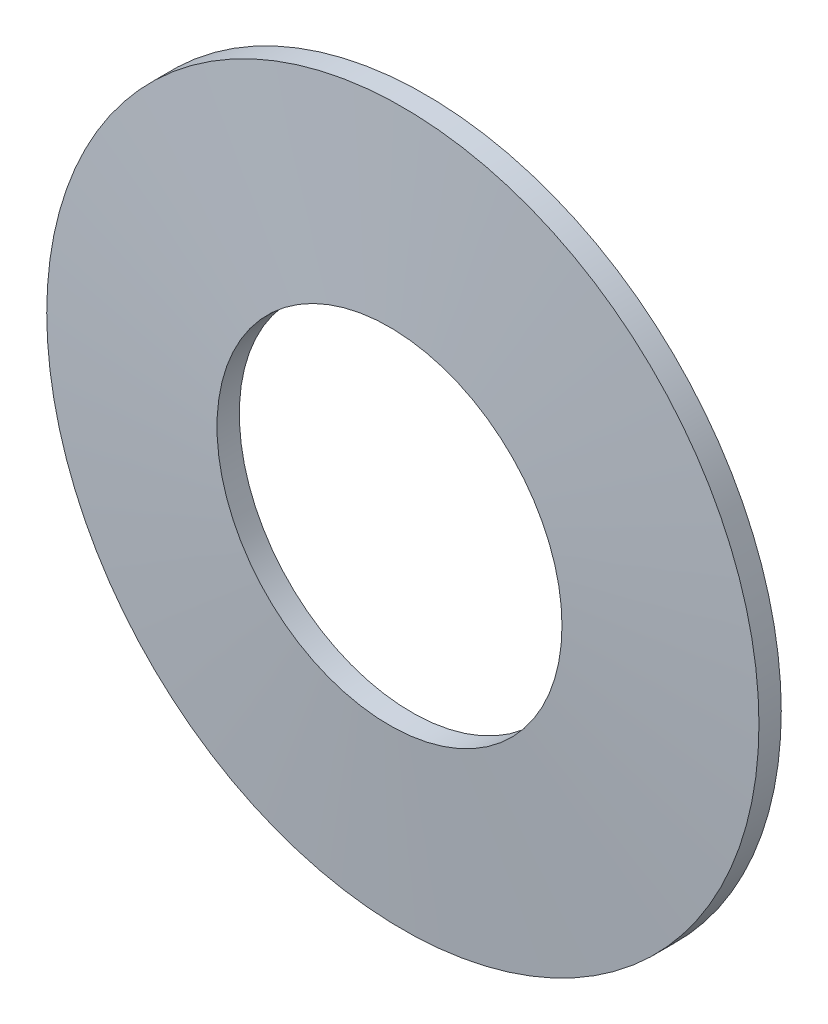
ISO-10303-21;
HEADER;
FILE_DESCRIPTION(('STEP AP214'),'2;1');
FILE_NAME('part.step','',(''),(''),'','','');
FILE_SCHEMA(('AUTOMOTIVE_DESIGN { 1 0 10303 214 1 1 1 1 }'));
ENDSEC;
DATA;
#1=APPLICATION_CONTEXT('core data for automotive mechanical design processes');
#2=APPLICATION_PROTOCOL_DEFINITION('international standard','automotive_design',2000,#1);
#3=PRODUCT_CONTEXT('',#1,'mechanical');
#4=PRODUCT('Part','Part','',(#3));
#5=PRODUCT_RELATED_PRODUCT_CATEGORY('part','',(#4));
#6=PRODUCT_DEFINITION_FORMATION('','',#4);
#7=PRODUCT_DEFINITION_CONTEXT('part definition',#1,'design');
#8=PRODUCT_DEFINITION('design','',#6,#7);
#9=PRODUCT_DEFINITION_SHAPE('','',#8);
#10=(LENGTH_UNIT() NAMED_UNIT(*) SI_UNIT(.MILLI.,.METRE.));
#11=(NAMED_UNIT(*) PLANE_ANGLE_UNIT() SI_UNIT($,.RADIAN.));
#12=(NAMED_UNIT(*) SI_UNIT($,.STERADIAN.) SOLID_ANGLE_UNIT());
#13=UNCERTAINTY_MEASURE_WITH_UNIT(LENGTH_MEASURE(1.E-05),#10,'distance_accuracy_value','');
#14=(GEOMETRIC_REPRESENTATION_CONTEXT(3) GLOBAL_UNCERTAINTY_ASSIGNED_CONTEXT((#13)) GLOBAL_UNIT_ASSIGNED_CONTEXT((#10,
#11,#12)) REPRESENTATION_CONTEXT('',''));
#15=CARTESIAN_POINT('',(0.,0.,0.));
#16=DIRECTION('',(0.,0.,1.));
#17=DIRECTION('',(1.,0.,0.));
#18=AXIS2_PLACEMENT_3D('',#15,#16,#17);
#19=CARTESIAN_POINT('',(0.,0.,13.8176));
#20=DIRECTION('',(0.,0.,1.));
#21=DIRECTION('',(1.,0.,0.));
#22=AXIS2_PLACEMENT_3D('',#19,#20,#21);
#23=CYLINDRICAL_SURFACE('',#22,7.75);
#24=CARTESIAN_POINT('',(0.,0.,0.997358859711838));
#25=DIRECTION('',(0.,0.,1.));
#26=DIRECTION('',(1.,0.,0.));
#27=AXIS2_PLACEMENT_3D('',#24,#25,#26);
#28=CIRCLE('',#27,7.75);
#29=CARTESIAN_POINT('',(7.75,0.,0.997358859711838));
#30=VERTEX_POINT('',#29);
#31=EDGE_CURVE('E10',#30,#30,#28,.T.);
#32=ORIENTED_EDGE('',*,*,#31,.F.);
#33=EDGE_LOOP('',(#32));
#34=FACE_BOUND('',#33,.T.);
#35=CARTESIAN_POINT('',(0.,0.,2.));
#36=DIRECTION('',(0.,0.,1.));
#37=DIRECTION('',(1.,0.,0.));
#38=AXIS2_PLACEMENT_3D('',#35,#36,#37);
#39=CIRCLE('',#38,7.75);
#40=CARTESIAN_POINT('',(7.75,0.,2.));
#41=VERTEX_POINT('',#40);
#42=EDGE_CURVE('E362',#41,#41,#39,.T.);
#43=ORIENTED_EDGE('',*,*,#42,.T.);
#44=EDGE_LOOP('',(#43));
#45=FACE_BOUND('',#44,.T.);
#46=ADVANCED_FACE('F348',(#34,#45),#23,.F.);
#47=CARTESIAN_POINT('',(0.,0.,0.997358859711838));
#48=DIRECTION('',(0.,0.,-1.));
#49=DIRECTION('',(-1.,0.,0.));
#50=AXIS2_PLACEMENT_3D('',#47,#48,#49);
#51=CONICAL_SURFACE('',#50,7.75,1.4981968730644);
#52=CARTESIAN_POINT('',(0.,0.,0.39735885971184));
#53=DIRECTION('',(0.,0.,1.));
#54=DIRECTION('',(1.,0.,0.));
#55=AXIS2_PLACEMENT_3D('',#52,#53,#54);
#56=CIRCLE('',#55,16.);
#57=CARTESIAN_POINT('',(16.,0.,0.39735885971184));
#58=VERTEX_POINT('',#57);
#59=EDGE_CURVE('E354',#58,#58,#56,.T.);
#60=ORIENTED_EDGE('',*,*,#59,.F.);
#61=EDGE_LOOP('',(#60));
#62=FACE_BOUND('',#61,.T.);
#63=ORIENTED_EDGE('',*,*,#31,.T.);
#64=EDGE_LOOP('',(#63));
#65=FACE_BOUND('',#64,.T.);
#66=ADVANCED_FACE('F377',(#62,#65),#51,.F.);
#67=CARTESIAN_POINT('',(0.,0.,13.8176));
#68=DIRECTION('',(0.,0.,1.));
#69=DIRECTION('',(1.,0.,0.));
#70=AXIS2_PLACEMENT_3D('',#67,#68,#69);
#71=CYLINDRICAL_SURFACE('',#70,16.);
#72=CARTESIAN_POINT('',(0.,0.,1.4));
#73=DIRECTION('',(0.,0.,1.));
#74=DIRECTION('',(1.,0.,0.));
#75=AXIS2_PLACEMENT_3D('',#72,#73,#74);
#76=CIRCLE('',#75,16.);
#77=CARTESIAN_POINT('',(16.,0.,1.4));
#78=VERTEX_POINT('',#77);
#79=EDGE_CURVE('E358',#78,#78,#76,.T.);
#80=ORIENTED_EDGE('',*,*,#79,.F.);
#81=EDGE_LOOP('',(#80));
#82=FACE_BOUND('',#81,.T.);
#83=ORIENTED_EDGE('',*,*,#59,.T.);
#84=EDGE_LOOP('',(#83));
#85=FACE_BOUND('',#84,.T.);
#86=ADVANCED_FACE('F372',(#82,#85),#71,.T.);
#87=CARTESIAN_POINT('',(0.,0.,1.4));
#88=DIRECTION('',(0.,0.,-1.));
#89=DIRECTION('',(-1.,0.,0.));
#90=AXIS2_PLACEMENT_3D('',#87,#88,#89);
#91=CONICAL_SURFACE('',#90,16.,1.4981968730644);
#92=ORIENTED_EDGE('',*,*,#42,.F.);
#93=EDGE_LOOP('',(#92));
#94=FACE_BOUND('',#93,.T.);
#95=ORIENTED_EDGE('',*,*,#79,.T.);
#96=EDGE_LOOP('',(#95));
#97=FACE_BOUND('',#96,.T.);
#98=ADVANCED_FACE('F369',(#94,#97),#91,.T.);
#99=CLOSED_SHELL('',(#46,#66,#86,#98));
#100=MANIFOLD_SOLID_BREP('B2',#99);
#101=ADVANCED_BREP_SHAPE_REPRESENTATION('',(#18,#100),#14);
#102=SHAPE_DEFINITION_REPRESENTATION(#9,#101);
ENDSEC;
END-ISO-10303-21;
